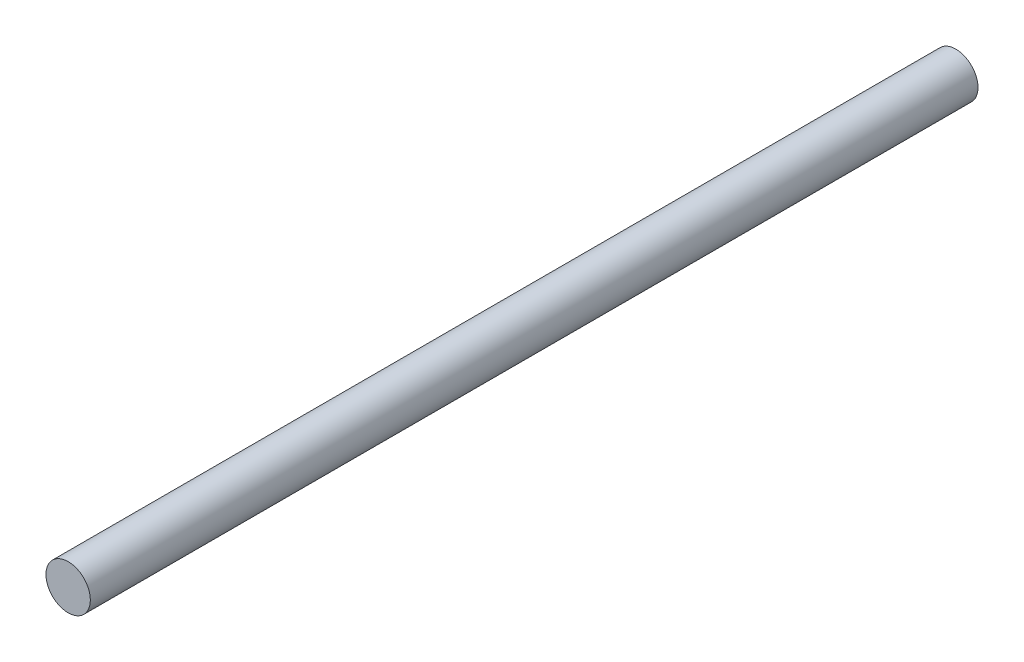
ISO-10303-21;
HEADER;
FILE_DESCRIPTION(('STEP AP214'),'2;1');
FILE_NAME('part.step','',(''),(''),'','','');
FILE_SCHEMA(('AUTOMOTIVE_DESIGN { 1 0 10303 214 1 1 1 1 }'));
ENDSEC;
DATA;
#1=APPLICATION_CONTEXT('core data for automotive mechanical design processes');
#2=APPLICATION_PROTOCOL_DEFINITION('international standard','automotive_design',2000,#1);
#3=PRODUCT_CONTEXT('',#1,'mechanical');
#4=PRODUCT('Part','Part','',(#3));
#5=PRODUCT_RELATED_PRODUCT_CATEGORY('part','',(#4));
#6=PRODUCT_DEFINITION_FORMATION('','',#4);
#7=PRODUCT_DEFINITION_CONTEXT('part definition',#1,'design');
#8=PRODUCT_DEFINITION('design','',#6,#7);
#9=PRODUCT_DEFINITION_SHAPE('','',#8);
#10=(LENGTH_UNIT() NAMED_UNIT(*) SI_UNIT(.MILLI.,.METRE.));
#11=(NAMED_UNIT(*) PLANE_ANGLE_UNIT() SI_UNIT($,.RADIAN.));
#12=(NAMED_UNIT(*) SI_UNIT($,.STERADIAN.) SOLID_ANGLE_UNIT());
#13=UNCERTAINTY_MEASURE_WITH_UNIT(LENGTH_MEASURE(1.E-05),#10,'distance_accuracy_value','');
#14=(GEOMETRIC_REPRESENTATION_CONTEXT(3) GLOBAL_UNCERTAINTY_ASSIGNED_CONTEXT((#13)) GLOBAL_UNIT_ASSIGNED_CONTEXT((#10,
#11,#12)) REPRESENTATION_CONTEXT('',''));
#15=CARTESIAN_POINT('',(0.,0.,0.));
#16=DIRECTION('',(0.,0.,1.));
#17=DIRECTION('',(1.,0.,0.));
#18=AXIS2_PLACEMENT_3D('',#15,#16,#17);
#19=CARTESIAN_POINT('',(0.,0.,250.));
#20=DIRECTION('',(0.,0.,-1.));
#21=DIRECTION('',(-1.,0.,0.));
#22=AXIS2_PLACEMENT_3D('',#19,#20,#21);
#23=CYLINDRICAL_SURFACE('',#22,6.25);
#24=CARTESIAN_POINT('',(0.,0.,250.));
#25=DIRECTION('',(0.,0.,1.));
#26=DIRECTION('',(1.,0.,0.));
#27=AXIS2_PLACEMENT_3D('',#24,#25,#26);
#28=CIRCLE('',#27,6.25);
#29=CARTESIAN_POINT('',(6.25,0.,250.));
#30=VERTEX_POINT('',#29);
#31=EDGE_CURVE('E10',#30,#30,#28,.T.);
#32=ORIENTED_EDGE('',*,*,#31,.F.);
#33=EDGE_LOOP('',(#32));
#34=FACE_BOUND('',#33,.T.);
#35=CARTESIAN_POINT('',(0.,0.,0.));
#36=DIRECTION('',(0.,0.,1.));
#37=DIRECTION('',(1.,0.,0.));
#38=AXIS2_PLACEMENT_3D('',#35,#36,#37);
#39=CIRCLE('',#38,6.25);
#40=CARTESIAN_POINT('',(6.25,0.,0.));
#41=VERTEX_POINT('',#40);
#42=EDGE_CURVE('E40',#41,#41,#39,.T.);
#43=ORIENTED_EDGE('',*,*,#42,.T.);
#44=EDGE_LOOP('',(#43));
#45=FACE_BOUND('',#44,.T.);
#46=ADVANCED_FACE('F37',(#34,#45),#23,.T.);
#47=CARTESIAN_POINT('',(0.,0.,250.));
#48=DIRECTION('',(0.,0.,1.));
#49=DIRECTION('',(1.,0.,0.));
#50=AXIS2_PLACEMENT_3D('',#47,#48,#49);
#51=PLANE('',#50);
#52=ORIENTED_EDGE('',*,*,#31,.T.);
#53=EDGE_LOOP('',(#52));
#54=FACE_BOUND('',#53,.T.);
#55=ADVANCED_FACE('F52',(#54),#51,.T.);
#56=CARTESIAN_POINT('',(0.,0.,0.));
#57=DIRECTION('',(0.,0.,1.));
#58=DIRECTION('',(1.,0.,0.));
#59=AXIS2_PLACEMENT_3D('',#56,#57,#58);
#60=PLANE('',#59);
#61=ORIENTED_EDGE('',*,*,#42,.F.);
#62=EDGE_LOOP('',(#61));
#63=FACE_BOUND('',#62,.T.);
#64=ADVANCED_FACE('F50',(#63),#60,.F.);
#65=CLOSED_SHELL('',(#46,#55,#64));
#66=MANIFOLD_SOLID_BREP('B2',#65);
#67=ADVANCED_BREP_SHAPE_REPRESENTATION('',(#18,#66),#14);
#68=SHAPE_DEFINITION_REPRESENTATION(#9,#67);
ENDSEC;
END-ISO-10303-21;
